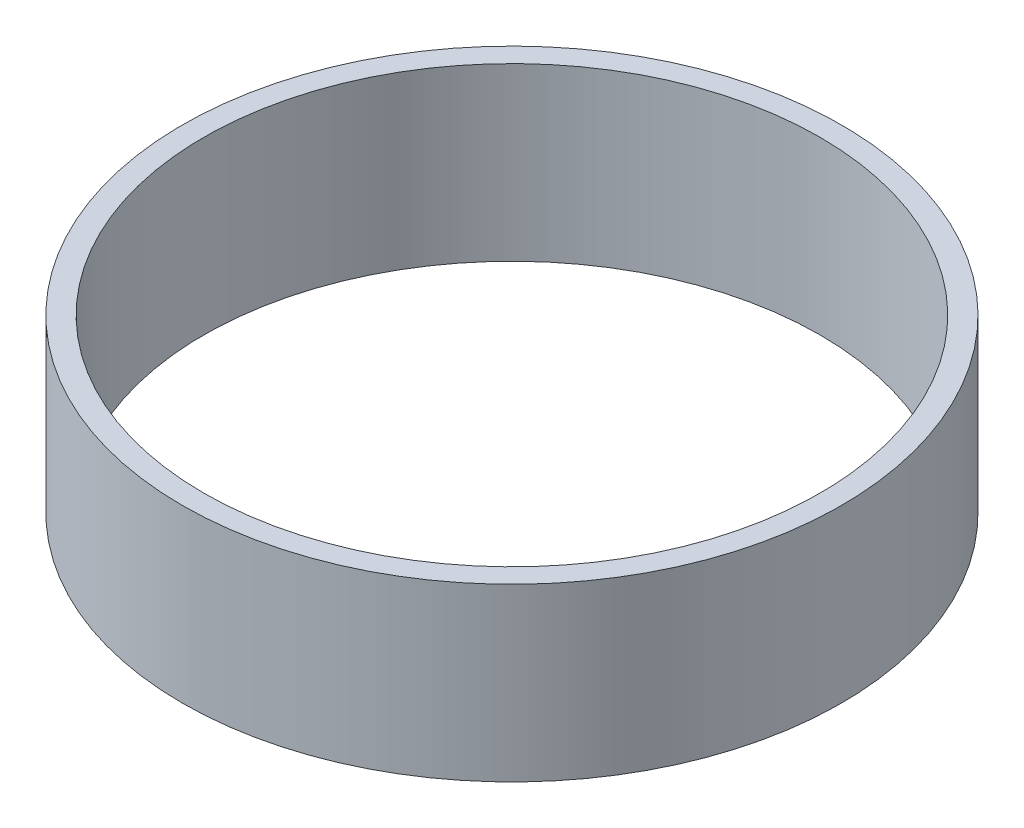
ISO-10303-21;
HEADER;
FILE_DESCRIPTION(('STEP AP214'),'2;1');
FILE_NAME('part.step','',(''),(''),'','','');
FILE_SCHEMA(('AUTOMOTIVE_DESIGN { 1 0 10303 214 1 1 1 1 }'));
ENDSEC;
DATA;
#1=APPLICATION_CONTEXT('core data for automotive mechanical design processes');
#2=APPLICATION_PROTOCOL_DEFINITION('international standard','automotive_design',2000,#1);
#3=PRODUCT_CONTEXT('',#1,'mechanical');
#4=PRODUCT('Part','Part','',(#3));
#5=PRODUCT_RELATED_PRODUCT_CATEGORY('part','',(#4));
#6=PRODUCT_DEFINITION_FORMATION('','',#4);
#7=PRODUCT_DEFINITION_CONTEXT('part definition',#1,'design');
#8=PRODUCT_DEFINITION('design','',#6,#7);
#9=PRODUCT_DEFINITION_SHAPE('','',#8);
#10=(LENGTH_UNIT() NAMED_UNIT(*) SI_UNIT(.MILLI.,.METRE.));
#11=(NAMED_UNIT(*) PLANE_ANGLE_UNIT() SI_UNIT($,.RADIAN.));
#12=(NAMED_UNIT(*) SI_UNIT($,.STERADIAN.) SOLID_ANGLE_UNIT());
#13=UNCERTAINTY_MEASURE_WITH_UNIT(LENGTH_MEASURE(1.E-05),#10,'distance_accuracy_value','');
#14=(GEOMETRIC_REPRESENTATION_CONTEXT(3) GLOBAL_UNCERTAINTY_ASSIGNED_CONTEXT((#13)) GLOBAL_UNIT_ASSIGNED_CONTEXT((#10,
#11,#12)) REPRESENTATION_CONTEXT('',''));
#15=CARTESIAN_POINT('',(0.,0.,0.));
#16=DIRECTION('',(0.,0.,1.));
#17=DIRECTION('',(1.,0.,0.));
#18=AXIS2_PLACEMENT_3D('',#15,#16,#17);
#19=CARTESIAN_POINT('',(1.41488933088538,12.,-0.597729789590246));
#20=DIRECTION('',(0.,1.,0.));
#21=DIRECTION('',(0.,0.,1.));
#22=AXIS2_PLACEMENT_3D('',#19,#20,#21);
#23=PLANE('',#22);
#24=CARTESIAN_POINT('',(1.41488933088538,12.,-0.597729789590246));
#25=DIRECTION('',(0.,1.,0.));
#26=DIRECTION('',(0.,0.,1.));
#27=AXIS2_PLACEMENT_3D('',#24,#25,#26);
#28=CIRCLE('',#27,23.1);
#29=CARTESIAN_POINT('',(1.41488933088538,12.,22.5022702104098));
#30=VERTEX_POINT('',#29);
#31=EDGE_CURVE('E10',#30,#30,#28,.T.);
#32=ORIENTED_EDGE('',*,*,#31,.T.);
#33=EDGE_LOOP('',(#32));
#34=FACE_BOUND('',#33,.T.);
#35=CARTESIAN_POINT('',(1.41488933088538,12.,-0.597729789590246));
#36=DIRECTION('',(0.,1.,0.));
#37=DIRECTION('',(0.,0.,1.));
#38=AXIS2_PLACEMENT_3D('',#35,#36,#37);
#39=CIRCLE('',#38,21.6);
#40=CARTESIAN_POINT('',(1.41488933088538,12.,21.0022702104098));
#41=VERTEX_POINT('',#40);
#42=EDGE_CURVE('E45',#41,#41,#39,.T.);
#43=ORIENTED_EDGE('',*,*,#42,.F.);
#44=EDGE_LOOP('',(#43));
#45=FACE_BOUND('',#44,.T.);
#46=ADVANCED_FACE('F34',(#34,#45),#23,.T.);
#47=CARTESIAN_POINT('',(1.41488933088538,0.,-0.597729789590246));
#48=DIRECTION('',(0.,1.,0.));
#49=DIRECTION('',(0.,0.,1.));
#50=AXIS2_PLACEMENT_3D('',#47,#48,#49);
#51=PLANE('',#50);
#52=CARTESIAN_POINT('',(1.41488933088538,0.,-0.597729789590246));
#53=DIRECTION('',(0.,1.,0.));
#54=DIRECTION('',(0.,0.,1.));
#55=AXIS2_PLACEMENT_3D('',#52,#53,#54);
#56=CIRCLE('',#55,23.1);
#57=CARTESIAN_POINT('',(1.41488933088538,0.,22.5022702104098));
#58=VERTEX_POINT('',#57);
#59=EDGE_CURVE('E38',#58,#58,#56,.T.);
#60=ORIENTED_EDGE('',*,*,#59,.F.);
#61=EDGE_LOOP('',(#60));
#62=FACE_BOUND('',#61,.T.);
#63=CARTESIAN_POINT('',(1.41488933088538,0.,-0.597729789590246));
#64=DIRECTION('',(0.,1.,0.));
#65=DIRECTION('',(0.,0.,1.));
#66=AXIS2_PLACEMENT_3D('',#63,#64,#65);
#67=CIRCLE('',#66,21.6);
#68=CARTESIAN_POINT('',(1.41488933088538,0.,21.0022702104098));
#69=VERTEX_POINT('',#68);
#70=EDGE_CURVE('E47',#69,#69,#67,.T.);
#71=ORIENTED_EDGE('',*,*,#70,.T.);
#72=EDGE_LOOP('',(#71));
#73=FACE_BOUND('',#72,.T.);
#74=ADVANCED_FACE('F57',(#62,#73),#51,.F.);
#75=CARTESIAN_POINT('',(1.41488933088538,12.,-0.597729789590246));
#76=DIRECTION('',(0.,-1.,0.));
#77=DIRECTION('',(0.,0.,-1.));
#78=AXIS2_PLACEMENT_3D('',#75,#76,#77);
#79=CYLINDRICAL_SURFACE('',#78,23.1);
#80=ORIENTED_EDGE('',*,*,#31,.F.);
#81=EDGE_LOOP('',(#80));
#82=FACE_BOUND('',#81,.T.);
#83=ORIENTED_EDGE('',*,*,#59,.T.);
#84=EDGE_LOOP('',(#83));
#85=FACE_BOUND('',#84,.T.);
#86=ADVANCED_FACE('F36',(#82,#85),#79,.T.);
#87=CARTESIAN_POINT('',(1.41488933088538,12.,-0.597729789590246));
#88=DIRECTION('',(0.,-1.,0.));
#89=DIRECTION('',(0.,0.,-1.));
#90=AXIS2_PLACEMENT_3D('',#87,#88,#89);
#91=CYLINDRICAL_SURFACE('',#90,21.6);
#92=ORIENTED_EDGE('',*,*,#42,.T.);
#93=EDGE_LOOP('',(#92));
#94=FACE_BOUND('',#93,.T.);
#95=ORIENTED_EDGE('',*,*,#70,.F.);
#96=EDGE_LOOP('',(#95));
#97=FACE_BOUND('',#96,.T.);
#98=ADVANCED_FACE('F53',(#94,#97),#91,.F.);
#99=CLOSED_SHELL('',(#46,#74,#86,#98));
#100=MANIFOLD_SOLID_BREP('B2',#99);
#101=ADVANCED_BREP_SHAPE_REPRESENTATION('',(#18,#100),#14);
#102=SHAPE_DEFINITION_REPRESENTATION(#9,#101);
ENDSEC;
END-ISO-10303-21;
